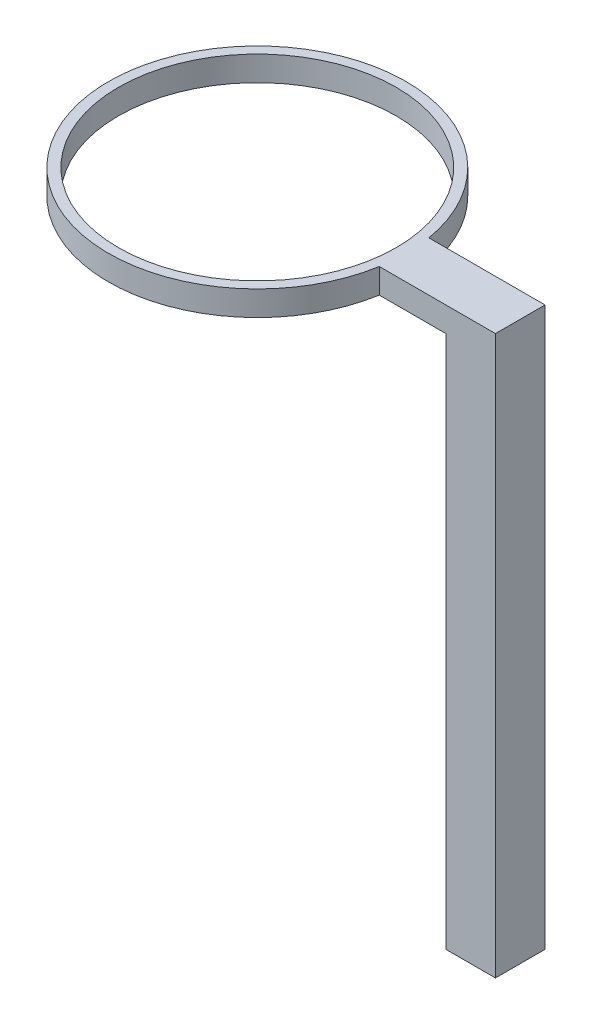
ISO-10303-21;
HEADER;
FILE_DESCRIPTION(('STEP AP214'),'2;1');
FILE_NAME('part.step','',(''),(''),'','','');
FILE_SCHEMA(('AUTOMOTIVE_DESIGN { 1 0 10303 214 1 1 1 1 }'));
ENDSEC;
DATA;
#1=APPLICATION_CONTEXT('core data for automotive mechanical design processes');
#2=APPLICATION_PROTOCOL_DEFINITION('international standard','automotive_design',2000,#1);
#3=PRODUCT_CONTEXT('',#1,'mechanical');
#4=PRODUCT('Part','Part','',(#3));
#5=PRODUCT_RELATED_PRODUCT_CATEGORY('part','',(#4));
#6=PRODUCT_DEFINITION_FORMATION('','',#4);
#7=PRODUCT_DEFINITION_CONTEXT('part definition',#1,'design');
#8=PRODUCT_DEFINITION('design','',#6,#7);
#9=PRODUCT_DEFINITION_SHAPE('','',#8);
#10=(LENGTH_UNIT() NAMED_UNIT(*) SI_UNIT(.MILLI.,.METRE.));
#11=(NAMED_UNIT(*) PLANE_ANGLE_UNIT() SI_UNIT($,.RADIAN.));
#12=(NAMED_UNIT(*) SI_UNIT($,.STERADIAN.) SOLID_ANGLE_UNIT());
#13=UNCERTAINTY_MEASURE_WITH_UNIT(LENGTH_MEASURE(1.E-05),#10,'distance_accuracy_value','');
#14=(GEOMETRIC_REPRESENTATION_CONTEXT(3) GLOBAL_UNCERTAINTY_ASSIGNED_CONTEXT((#13)) GLOBAL_UNIT_ASSIGNED_CONTEXT((#10,
#11,#12)) REPRESENTATION_CONTEXT('',''));
#15=CARTESIAN_POINT('',(0.,0.,0.));
#16=DIRECTION('',(0.,0.,1.));
#17=DIRECTION('',(1.,0.,0.));
#18=AXIS2_PLACEMENT_3D('',#15,#16,#17);
#19=CARTESIAN_POINT('',(-43.,112.5,0.));
#20=DIRECTION('',(0.,-1.,0.));
#21=DIRECTION('',(0.,0.,-1.));
#22=AXIS2_PLACEMENT_3D('',#19,#20,#21);
#23=CYLINDRICAL_SURFACE('',#22,30.);
#24=DIRECTION('',(0.,-1.,0.));
#25=VECTOR('',#24,1.);
#26=CARTESIAN_POINT('',(-13.4196010845019,112.5,-5.));
#27=LINE('',#26,#25);
#28=CARTESIAN_POINT('',(-13.4196010845019,112.5,-5.));
#29=VERTEX_POINT('',#28);
#30=CARTESIAN_POINT('',(-13.4196010845019,107.5,-5.));
#31=VERTEX_POINT('',#30);
#32=EDGE_CURVE('E133',#29,#31,#27,.T.);
#33=ORIENTED_EDGE('',*,*,#32,.T.);
#34=CARTESIAN_POINT('',(-43.,107.5,0.));
#35=DIRECTION('',(0.,1.,0.));
#36=DIRECTION('',(0.,0.,1.));
#37=AXIS2_PLACEMENT_3D('',#34,#35,#36);
#38=CIRCLE('',#37,30.);
#39=CARTESIAN_POINT('',(-13.4196010844789,107.5,5.));
#40=VERTEX_POINT('',#39);
#41=EDGE_CURVE('E41',#31,#40,#38,.T.);
#42=ORIENTED_EDGE('',*,*,#41,.T.);
#43=DIRECTION('',(0.,-1.,0.));
#44=VECTOR('',#43,1.);
#45=CARTESIAN_POINT('',(-13.4196010845019,112.5,5.));
#46=LINE('',#45,#44);
#47=CARTESIAN_POINT('',(-13.4196010845019,112.5,5.));
#48=VERTEX_POINT('',#47);
#49=EDGE_CURVE('E135',#40,#48,#46,.F.);
#50=ORIENTED_EDGE('',*,*,#49,.T.);
#51=CARTESIAN_POINT('',(-43.,112.5,0.));
#52=DIRECTION('',(0.,1.,0.));
#53=DIRECTION('',(0.,0.,1.));
#54=AXIS2_PLACEMENT_3D('',#51,#52,#53);
#55=CIRCLE('',#54,30.);
#56=EDGE_CURVE('E11',#29,#48,#55,.T.);
#57=ORIENTED_EDGE('',*,*,#56,.F.);
#58=EDGE_LOOP('',(#33,#42,#50,#57));
#59=FACE_BOUND('',#58,.T.);
#60=ADVANCED_FACE('F33',(#59),#23,.T.);
#61=CARTESIAN_POINT('',(-43.,112.5,0.));
#62=DIRECTION('',(0.,1.,0.));
#63=DIRECTION('',(0.,0.,1.));
#64=AXIS2_PLACEMENT_3D('',#61,#62,#63);
#65=PLANE('',#64);
#66=ORIENTED_EDGE('',*,*,#56,.T.);
#67=DIRECTION('',(1.,0.,0.));
#68=VECTOR('',#67,1.);
#69=CARTESIAN_POINT('',(-500000.,112.5,5.));
#70=LINE('',#69,#68);
#71=CARTESIAN_POINT('',(10.,112.5,5.));
#72=VERTEX_POINT('',#71);
#73=EDGE_CURVE('E84',#48,#72,#70,.T.);
#74=ORIENTED_EDGE('',*,*,#73,.T.);
#75=DIRECTION('',(0.,0.,-1.));
#76=VECTOR('',#75,1.);
#77=CARTESIAN_POINT('',(10.,112.5,5.));
#78=LINE('',#77,#76);
#79=CARTESIAN_POINT('',(10.,112.5,-5.));
#80=VERTEX_POINT('',#79);
#81=EDGE_CURVE('E89',#72,#80,#78,.T.);
#82=ORIENTED_EDGE('',*,*,#81,.T.);
#83=DIRECTION('',(1.,0.,0.));
#84=VECTOR('',#83,1.);
#85=CARTESIAN_POINT('',(-500000.,112.5,-5.));
#86=LINE('',#85,#84);
#87=EDGE_CURVE('E48',#29,#80,#86,.T.);
#88=ORIENTED_EDGE('',*,*,#87,.F.);
#89=EDGE_LOOP('',(#66,#74,#82,#88));
#90=FACE_BOUND('',#89,.T.);
#91=CARTESIAN_POINT('',(-43.,112.5,0.));
#92=DIRECTION('',(0.,1.,0.));
#93=DIRECTION('',(0.,0.,1.));
#94=AXIS2_PLACEMENT_3D('',#91,#92,#93);
#95=CIRCLE('',#94,28.);
#96=CARTESIAN_POINT('',(-43.,112.5,28.));
#97=VERTEX_POINT('',#96);
#98=EDGE_CURVE('E139',#97,#97,#95,.T.);
#99=ORIENTED_EDGE('',*,*,#98,.F.);
#100=EDGE_LOOP('',(#99));
#101=FACE_BOUND('',#100,.T.);
#102=ADVANCED_FACE('F86',(#90,#101),#65,.T.);
#103=CARTESIAN_POINT('',(-43.,107.5,0.));
#104=DIRECTION('',(0.,1.,0.));
#105=DIRECTION('',(0.,0.,1.));
#106=AXIS2_PLACEMENT_3D('',#103,#104,#105);
#107=PLANE('',#106);
#108=ORIENTED_EDGE('',*,*,#41,.F.);
#109=DIRECTION('',(1.,0.,0.));
#110=VECTOR('',#109,1.);
#111=CARTESIAN_POINT('',(-500000.,107.5,-5.));
#112=LINE('',#111,#110);
#113=CARTESIAN_POINT('',(0.,107.50000000013,-5.));
#114=VERTEX_POINT('',#113);
#115=EDGE_CURVE('E55',#31,#114,#112,.T.);
#116=ORIENTED_EDGE('',*,*,#115,.T.);
#117=DIRECTION('',(0.,0.,1.));
#118=VECTOR('',#117,1.);
#119=CARTESIAN_POINT('',(0.,107.500000000016,-5.));
#120=LINE('',#119,#118);
#121=CARTESIAN_POINT('',(0.,107.5,5.));
#122=VERTEX_POINT('',#121);
#123=EDGE_CURVE('E108',#114,#122,#120,.T.);
#124=ORIENTED_EDGE('',*,*,#123,.T.);
#125=DIRECTION('',(1.,0.,0.));
#126=VECTOR('',#125,1.);
#127=CARTESIAN_POINT('',(-500000.,107.5,5.));
#128=LINE('',#127,#126);
#129=EDGE_CURVE('E93',#40,#122,#128,.T.);
#130=ORIENTED_EDGE('',*,*,#129,.F.);
#131=EDGE_LOOP('',(#108,#116,#124,#130));
#132=FACE_BOUND('',#131,.T.);
#133=CARTESIAN_POINT('',(-43.,107.5,0.));
#134=DIRECTION('',(0.,1.,0.));
#135=DIRECTION('',(0.,0.,1.));
#136=AXIS2_PLACEMENT_3D('',#133,#134,#135);
#137=CIRCLE('',#136,28.);
#138=CARTESIAN_POINT('',(-43.,107.5,28.));
#139=VERTEX_POINT('',#138);
#140=EDGE_CURVE('E137',#139,#139,#137,.T.);
#141=ORIENTED_EDGE('',*,*,#140,.T.);
#142=EDGE_LOOP('',(#141));
#143=FACE_BOUND('',#142,.T.);
#144=ADVANCED_FACE('F150',(#132,#143),#107,.F.);
#145=CARTESIAN_POINT('',(-43.,112.5,0.));
#146=DIRECTION('',(0.,-1.,0.));
#147=DIRECTION('',(0.,0.,-1.));
#148=AXIS2_PLACEMENT_3D('',#145,#146,#147);
#149=CYLINDRICAL_SURFACE('',#148,28.);
#150=ORIENTED_EDGE('',*,*,#98,.T.);
#151=EDGE_LOOP('',(#150));
#152=FACE_BOUND('',#151,.T.);
#153=ORIENTED_EDGE('',*,*,#140,.F.);
#154=EDGE_LOOP('',(#153));
#155=FACE_BOUND('',#154,.T.);
#156=ADVANCED_FACE('F175',(#152,#155),#149,.F.);
#157=CARTESIAN_POINT('',(-500000.,112.5,-5.));
#158=DIRECTION('',(0.,0.,1.));
#159=DIRECTION('',(1.,0.,0.));
#160=AXIS2_PLACEMENT_3D('',#157,#158,#159);
#161=PLANE('',#160);
#162=ORIENTED_EDGE('',*,*,#32,.F.);
#163=ORIENTED_EDGE('',*,*,#87,.T.);
#164=DIRECTION('',(0.,1.,0.));
#165=VECTOR('',#164,1.);
#166=CARTESIAN_POINT('',(10.,70.,-5.));
#167=LINE('',#166,#165);
#168=CARTESIAN_POINT('',(10.,0.,-5.));
#169=VERTEX_POINT('',#168);
#170=EDGE_CURVE('E107',#169,#80,#167,.T.);
#171=ORIENTED_EDGE('',*,*,#170,.F.);
#172=DIRECTION('',(1.,0.,0.));
#173=VECTOR('',#172,1.);
#174=CARTESIAN_POINT('',(10.,0.,-5.));
#175=LINE('',#174,#173);
#176=CARTESIAN_POINT('',(0.,0.,-5.));
#177=VERTEX_POINT('',#176);
#178=EDGE_CURVE('E112',#177,#169,#175,.T.);
#179=ORIENTED_EDGE('',*,*,#178,.F.);
#180=DIRECTION('',(0.,-1.,0.));
#181=VECTOR('',#180,1.);
#182=CARTESIAN_POINT('',(0.,0.,-5.));
#183=LINE('',#182,#181);
#184=EDGE_CURVE('E129',#114,#177,#183,.T.);
#185=ORIENTED_EDGE('',*,*,#184,.F.);
#186=ORIENTED_EDGE('',*,*,#115,.F.);
#187=EDGE_LOOP('',(#162,#163,#171,#179,#185,#186));
#188=FACE_BOUND('',#187,.T.);
#189=ADVANCED_FACE('F155',(#188),#161,.F.);
#190=CARTESIAN_POINT('',(-500000.,107.5,5.));
#191=DIRECTION('',(0.,0.,-1.));
#192=DIRECTION('',(-1.,0.,0.));
#193=AXIS2_PLACEMENT_3D('',#190,#191,#192);
#194=PLANE('',#193);
#195=ORIENTED_EDGE('',*,*,#49,.F.);
#196=ORIENTED_EDGE('',*,*,#129,.T.);
#197=DIRECTION('',(0.,-1.,0.));
#198=VECTOR('',#197,1.);
#199=CARTESIAN_POINT('',(0.,0.,5.));
#200=LINE('',#199,#198);
#201=CARTESIAN_POINT('',(0.,0.,5.));
#202=VERTEX_POINT('',#201);
#203=EDGE_CURVE('E103',#122,#202,#200,.T.);
#204=ORIENTED_EDGE('',*,*,#203,.T.);
#205=DIRECTION('',(1.,0.,0.));
#206=VECTOR('',#205,1.);
#207=CARTESIAN_POINT('',(10.,0.,5.));
#208=LINE('',#207,#206);
#209=CARTESIAN_POINT('',(10.,0.,5.));
#210=VERTEX_POINT('',#209);
#211=EDGE_CURVE('E99',#202,#210,#208,.T.);
#212=ORIENTED_EDGE('',*,*,#211,.T.);
#213=DIRECTION('',(0.,1.,0.));
#214=VECTOR('',#213,1.);
#215=CARTESIAN_POINT('',(10.,70.,5.));
#216=LINE('',#215,#214);
#217=EDGE_CURVE('E96',#210,#72,#216,.T.);
#218=ORIENTED_EDGE('',*,*,#217,.T.);
#219=ORIENTED_EDGE('',*,*,#73,.F.);
#220=EDGE_LOOP('',(#195,#196,#204,#212,#218,#219));
#221=FACE_BOUND('',#220,.T.);
#222=ADVANCED_FACE('F97',(#221),#194,.F.);
#223=CARTESIAN_POINT('',(10.,0.,5.));
#224=DIRECTION('',(0.,1.,0.));
#225=DIRECTION('',(-1.,0.,0.));
#226=AXIS2_PLACEMENT_3D('',#223,#224,#225);
#227=PLANE('',#226);
#228=ORIENTED_EDGE('',*,*,#178,.T.);
#229=DIRECTION('',(0.,0.,-1.));
#230=VECTOR('',#229,1.);
#231=CARTESIAN_POINT('',(10.,0.,5.));
#232=LINE('',#231,#230);
#233=EDGE_CURVE('E123',#210,#169,#232,.T.);
#234=ORIENTED_EDGE('',*,*,#233,.F.);
#235=ORIENTED_EDGE('',*,*,#211,.F.);
#236=DIRECTION('',(0.,0.,-1.));
#237=VECTOR('',#236,1.);
#238=CARTESIAN_POINT('',(0.,0.,5.));
#239=LINE('',#238,#237);
#240=EDGE_CURVE('E126',#202,#177,#239,.T.);
#241=ORIENTED_EDGE('',*,*,#240,.T.);
#242=EDGE_LOOP('',(#228,#234,#235,#241));
#243=FACE_BOUND('',#242,.T.);
#244=ADVANCED_FACE('F165',(#243),#227,.F.);
#245=CARTESIAN_POINT('',(10.,70.,5.));
#246=DIRECTION('',(-1.,0.,0.));
#247=DIRECTION('',(0.,-1.,0.));
#248=AXIS2_PLACEMENT_3D('',#245,#246,#247);
#249=PLANE('',#248);
#250=ORIENTED_EDGE('',*,*,#170,.T.);
#251=ORIENTED_EDGE('',*,*,#81,.F.);
#252=ORIENTED_EDGE('',*,*,#217,.F.);
#253=ORIENTED_EDGE('',*,*,#233,.T.);
#254=EDGE_LOOP('',(#250,#251,#252,#253));
#255=FACE_BOUND('',#254,.T.);
#256=ADVANCED_FACE('F106',(#255),#249,.F.);
#257=CARTESIAN_POINT('',(0.,0.,5.));
#258=DIRECTION('',(1.,0.,0.));
#259=DIRECTION('',(0.,0.,-1.));
#260=AXIS2_PLACEMENT_3D('',#257,#258,#259);
#261=PLANE('',#260);
#262=CARTESIAN_POINT('',(0.,7.5,0.));
#263=DIRECTION('',(-1.,0.,0.));
#264=DIRECTION('',(0.,0.,1.));
#265=AXIS2_PLACEMENT_3D('',#262,#263,#264);
#266=CIRCLE('',#265,2.);
#267=CARTESIAN_POINT('',(0.,7.5,2.));
#268=VERTEX_POINT('',#267);
#269=EDGE_CURVE('E115',#268,#268,#266,.T.);
#270=ORIENTED_EDGE('',*,*,#269,.F.);
#271=EDGE_LOOP('',(#270));
#272=FACE_BOUND('',#271,.T.);
#273=ORIENTED_EDGE('',*,*,#184,.T.);
#274=ORIENTED_EDGE('',*,*,#240,.F.);
#275=ORIENTED_EDGE('',*,*,#203,.F.);
#276=ORIENTED_EDGE('',*,*,#123,.F.);
#277=EDGE_LOOP('',(#273,#274,#275,#276));
#278=FACE_BOUND('',#277,.T.);
#279=ADVANCED_FACE('F161',(#272,#278),#261,.F.);
#280=CARTESIAN_POINT('',(6.,7.5,0.));
#281=DIRECTION('',(-1.,0.,0.));
#282=DIRECTION('',(0.,0.,1.));
#283=AXIS2_PLACEMENT_3D('',#280,#281,#282);
#284=CYLINDRICAL_SURFACE('',#283,2.);
#285=CARTESIAN_POINT('',(6.,7.5,0.));
#286=DIRECTION('',(-1.,0.,0.));
#287=DIRECTION('',(0.,0.,1.));
#288=AXIS2_PLACEMENT_3D('',#285,#286,#287);
#289=CIRCLE('',#288,2.);
#290=CARTESIAN_POINT('',(6.,7.5,2.));
#291=VERTEX_POINT('',#290);
#292=EDGE_CURVE('E109',#291,#291,#289,.T.);
#293=ORIENTED_EDGE('',*,*,#292,.F.);
#294=EDGE_LOOP('',(#293));
#295=FACE_BOUND('',#294,.T.);
#296=ORIENTED_EDGE('',*,*,#269,.T.);
#297=EDGE_LOOP('',(#296));
#298=FACE_BOUND('',#297,.T.);
#299=ADVANCED_FACE('F226',(#295,#298),#284,.F.);
#300=CARTESIAN_POINT('',(6.,7.5,0.));
#301=DIRECTION('',(-1.,0.,0.));
#302=DIRECTION('',(0.,0.,1.));
#303=AXIS2_PLACEMENT_3D('',#300,#301,#302);
#304=PLANE('',#303);
#305=ORIENTED_EDGE('',*,*,#292,.T.);
#306=EDGE_LOOP('',(#305));
#307=FACE_BOUND('',#306,.T.);
#308=ADVANCED_FACE('F234',(#307),#304,.T.);
#309=CLOSED_SHELL('',(#60,#102,#144,#156,#189,#222,#244,#256,#279,#299,#308));
#310=MANIFOLD_SOLID_BREP('B2',#309);
#311=ADVANCED_BREP_SHAPE_REPRESENTATION('',(#18,#310),#14);
#312=SHAPE_DEFINITION_REPRESENTATION(#9,#311);
ENDSEC;
END-ISO-10303-21;
